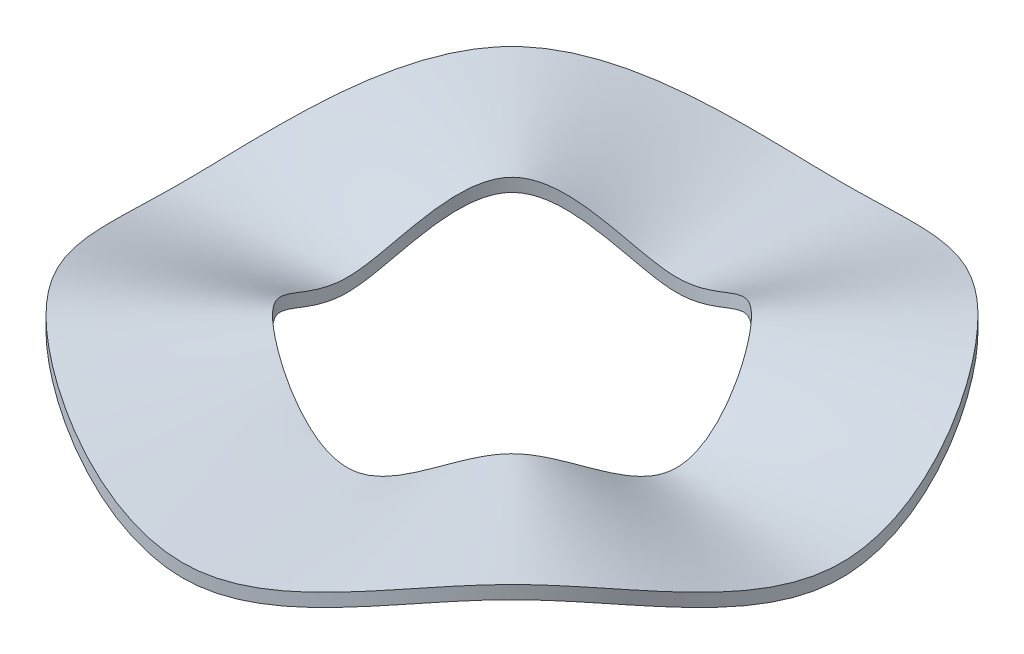
ISO-10303-21;
HEADER;
FILE_DESCRIPTION(('STEP AP214'),'2;1');
FILE_NAME('part.step','',(''),(''),'','','');
FILE_SCHEMA(('AUTOMOTIVE_DESIGN { 1 0 10303 214 1 1 1 1 }'));
ENDSEC;
DATA;
#1=APPLICATION_CONTEXT('core data for automotive mechanical design processes');
#2=APPLICATION_PROTOCOL_DEFINITION('international standard','automotive_design',2000,#1);
#3=PRODUCT_CONTEXT('',#1,'mechanical');
#4=PRODUCT('Part','Part','',(#3));
#5=PRODUCT_RELATED_PRODUCT_CATEGORY('part','',(#4));
#6=PRODUCT_DEFINITION_FORMATION('','',#4);
#7=PRODUCT_DEFINITION_CONTEXT('part definition',#1,'design');
#8=PRODUCT_DEFINITION('design','',#6,#7);
#9=PRODUCT_DEFINITION_SHAPE('','',#8);
#10=(LENGTH_UNIT() NAMED_UNIT(*) SI_UNIT(.MILLI.,.METRE.));
#11=(NAMED_UNIT(*) PLANE_ANGLE_UNIT() SI_UNIT($,.RADIAN.));
#12=(NAMED_UNIT(*) SI_UNIT($,.STERADIAN.) SOLID_ANGLE_UNIT());
#13=UNCERTAINTY_MEASURE_WITH_UNIT(LENGTH_MEASURE(1.E-05),#10,'distance_accuracy_value','');
#14=(GEOMETRIC_REPRESENTATION_CONTEXT(3) GLOBAL_UNCERTAINTY_ASSIGNED_CONTEXT((#13)) GLOBAL_UNIT_ASSIGNED_CONTEXT((#10,
#11,#12)) REPRESENTATION_CONTEXT('',''));
#15=CARTESIAN_POINT('',(0.,0.,0.));
#16=DIRECTION('',(0.,0.,1.));
#17=DIRECTION('',(1.,0.,0.));
#18=AXIS2_PLACEMENT_3D('',#15,#16,#17);
#19=CARTESIAN_POINT('',(0.,0.,-50.));
#20=CARTESIAN_POINT('',(0.681019374820098,0.,-49.9999999999936));
#21=CARTESIAN_POINT('',(2.04305812446038,0.0749999999999942,-49.9771529062029));
#22=CARTESIAN_POINT('',(4.08272213564324,0.389999999999995,-49.8743739349722));
#23=CARTESIAN_POINT('',(6.11559792027062,0.88499999999999,-49.7031195839857));
#24=CARTESIAN_POINT('',(18.2517585890349,4.79999999999999,-48.2649389042652));
#25=CARTESIAN_POINT('',(41.7750462400075,27.,-38.1370849893561));
#26=CARTESIAN_POINT('',(54.5694187554349,-15.,7.88759682568418E-10));
#27=CARTESIAN_POINT('',(40.8611624893339,30.,40.8611624895872));
#28=CARTESIAN_POINT('',(2.14408297973673E-11,-15.,54.5694187553029));
#29=CARTESIAN_POINT('',(-40.8611624890768,30.,40.8611624889877));
#30=CARTESIAN_POINT('',(-54.5694187554349,-15.,6.07656286399916E-11));
#31=CARTESIAN_POINT('',(-41.7750462402474,27.,-38.1370849899642));
#32=CARTESIAN_POINT('',(-18.2517585890206,4.80000000000001,-48.26493890461));
#33=CARTESIAN_POINT('',(-6.11559792026805,0.884999999999996,-49.7031195841012));
#34=CARTESIAN_POINT('',(-4.0827221356421,0.389999999999994,-49.8743739350492));
#35=CARTESIAN_POINT('',(-2.04305812446015,0.0749999999999938,-49.9771529062414));
#36=CARTESIAN_POINT('',(-0.681019374820087,0.,-50.0000000000064));
#37=CARTESIAN_POINT('',(0.,0.,-50.));
#38=CARTESIAN_POINT('',(0.,0.,-54.1666666666667));
#39=CARTESIAN_POINT('',(0.733102708153321,0.,-54.1666666666608));
#40=CARTESIAN_POINT('',(2.19930812446002,0.0749999999999947,-54.1412154062045));
#41=CARTESIAN_POINT('',(4.39502682314249,0.389999999999996,-54.0269129974757));
#42=CARTESIAN_POINT('',(6.58356667026945,0.88499999999999,-53.8367133339912));
#43=CARTESIAN_POINT('',(19.6501960890312,4.79999999999999,-52.2415014042833));
#44=CARTESIAN_POINT('',(45.0042129066908,27.,-41.0537516560638));
#45=CARTESIAN_POINT('',(59.2569187554349,-15.,7.22736107072741E-10));
#46=CARTESIAN_POINT('',(43.986162489316,30.,43.986162489548));
#47=CARTESIAN_POINT('',(1.96540646171112E-11,-15.,59.2569187553136));
#48=CARTESIAN_POINT('',(-43.9861624890804,30.,43.9861624889984));
#49=CARTESIAN_POINT('',(-59.2569187554349,-15.,5.54088025461752E-11));
#50=CARTESIAN_POINT('',(-45.0042129069107,27.,-41.0537516566212));
#51=CARTESIAN_POINT('',(-19.650196089018,4.80000000000001,-52.2415014045994));
#52=CARTESIAN_POINT('',(-6.58356667026708,0.884999999999996,-53.836713334097));
#53=CARTESIAN_POINT('',(-4.39502682314143,0.389999999999995,-54.0269129975463));
#54=CARTESIAN_POINT('',(-2.1993081244598,0.0749999999999943,-54.1412154062399));
#55=CARTESIAN_POINT('',(-0.733102708153293,0.,-54.1666666666725));
#56=CARTESIAN_POINT('',(0.,0.,-54.1666666666667));
#57=CARTESIAN_POINT('',(0.,0.,-62.5000000000001));
#58=CARTESIAN_POINT('',(0.837269374819747,0.,-62.4999999999953));
#59=CARTESIAN_POINT('',(2.51180812445929,0.0749999999999958,-62.4693404062079));
#60=CARTESIAN_POINT('',(5.01963619814097,0.389999999999997,-62.3319911224828));
#61=CARTESIAN_POINT('',(7.51950417026711,0.884999999999992,-62.1039008340022));
#62=CARTESIAN_POINT('',(22.4470710890237,4.79999999999999,-60.1946264043196));
#63=CARTESIAN_POINT('',(51.4625462400576,27.,-46.8870849894792));
#64=CARTESIAN_POINT('',(68.6319187554351,-15.,5.90688956081387E-10));
#65=CARTESIAN_POINT('',(50.2361624892805,30.,50.2361624894695));
#66=CARTESIAN_POINT('',(1.60909425974548E-11,-15.,68.631918755335));
#67=CARTESIAN_POINT('',(-50.2361624890876,30.,50.2361624890198));
#68=CARTESIAN_POINT('',(-68.631918755435,-15.,4.47072934228743E-11));
#69=CARTESIAN_POINT('',(-51.4625462402374,27.,-46.8870849899353));
#70=CARTESIAN_POINT('',(-22.4470710890129,4.80000000000001,-60.1946264045782));
#71=CARTESIAN_POINT('',(-7.51950417026518,0.884999999999997,-62.1039008340888));
#72=CARTESIAN_POINT('',(-5.01963619814011,0.389999999999996,-62.3319911225405));
#73=CARTESIAN_POINT('',(-2.51180812445911,0.0749999999999953,-62.4693404062368));
#74=CARTESIAN_POINT('',(-0.837269374819729,0.,-62.5000000000049));
#75=CARTESIAN_POINT('',(0.,0.,-62.5000000000001));
#76=CARTESIAN_POINT('',(0.,0.,-74.9999999999999));
#77=CARTESIAN_POINT('',(0.993519374819394,0.,-74.9999999999967));
#78=CARTESIAN_POINT('',(2.98055812445819,0.0749999999999974,-74.9615279062127));
#79=CARTESIAN_POINT('',(5.95655026063868,0.389999999999998,-74.7896083099931));
#80=CARTESIAN_POINT('',(8.92341042026357,0.884999999999993,-74.5046820840185));
#81=CARTESIAN_POINT('',(26.6423835890123,4.79999999999999,-72.1243139043738));
#82=CARTESIAN_POINT('',(61.1500462401073,27.,-55.6370849896023));
#83=CARTESIAN_POINT('',(82.6944187554347,-15.,3.92600882359595E-10));
#84=CARTESIAN_POINT('',(59.6111624892267,30.,59.6111624893517));
#85=CARTESIAN_POINT('',(1.07427901210183E-11,-15.,82.6944187553672));
#86=CARTESIAN_POINT('',(-59.6111624890982,30.,59.6111624890519));
#87=CARTESIAN_POINT('',(-82.6944187554348,-15.,2.86281415240452E-11));
#88=CARTESIAN_POINT('',(-61.1500462402273,27.,-55.6370849899063));
#89=CARTESIAN_POINT('',(-26.6423835890052,4.80000000000001,-72.1243139045462));
#90=CARTESIAN_POINT('',(-8.92341042026228,0.884999999999999,-74.5046820840762));
#91=CARTESIAN_POINT('',(-5.9565502606381,0.389999999999997,-74.7896083100316));
#92=CARTESIAN_POINT('',(-2.98055812445805,0.0749999999999968,-74.961527906232));
#93=CARTESIAN_POINT('',(-0.993519374819364,0.,-75.0000000000031));
#94=CARTESIAN_POINT('',(0.,0.,-74.9999999999999));
#95=CARTESIAN_POINT('',(0.,0.,-87.5));
#96=CARTESIAN_POINT('',(1.14976937481903,0.,-87.4999999999984));
#97=CARTESIAN_POINT('',(3.44930812445709,0.074999999999999,-87.4537154062178));
#98=CARTESIAN_POINT('',(6.89346432313641,0.39,-87.2472254975037));
#99=CARTESIAN_POINT('',(10.3273166702601,0.884999999999995,-86.905463334035));
#100=CARTESIAN_POINT('',(30.8376960890011,4.79999999999999,-84.0540014044283));
#101=CARTESIAN_POINT('',(70.8375462401575,27.,-64.3870849897255));
#102=CARTESIAN_POINT('',(96.756918755435,-15.,1.94545768383847E-10));
#103=CARTESIAN_POINT('',(68.9861624891734,30.,68.9861624892339));
#104=CARTESIAN_POINT('',(5.37382096287009E-12,-15.,96.7569187553992));
#105=CARTESIAN_POINT('',(-68.986162489109,30.,68.986162489084));
#106=CARTESIAN_POINT('',(-96.756918755435,-15.,1.25975618825436E-11));
#107=CARTESIAN_POINT('',(-70.8375462402174,27.,-64.3870849898775));
#108=CARTESIAN_POINT('',(-30.8376960889976,4.80000000000001,-84.0540014045144));
#109=CARTESIAN_POINT('',(-10.3273166702594,0.885,-86.9054633340639));
#110=CARTESIAN_POINT('',(-6.89346432313612,0.389999999999998,-87.2472254975229));
#111=CARTESIAN_POINT('',(-3.44930812445702,0.0749999999999983,-87.4537154062275));
#112=CARTESIAN_POINT('',(-1.14976937481902,0.,-87.5000000000016));
#113=CARTESIAN_POINT('',(0.,0.,-87.5));
#114=CARTESIAN_POINT('',(0.,0.,-95.8333333333333));
#115=CARTESIAN_POINT('',(1.25393604148547,0.,-95.8333333333328));
#116=CARTESIAN_POINT('',(3.76180812445636,0.075,-95.7818404062211));
#117=CARTESIAN_POINT('',(7.5180736981349,0.390000000000001,-95.5523036225106));
#118=CARTESIAN_POINT('',(11.2632541702577,0.884999999999996,-95.1726508340459));
#119=CARTESIAN_POINT('',(33.6345710889936,4.79999999999999,-92.0071264044645));
#120=CARTESIAN_POINT('',(77.295879573524,27.,-70.2204183231408));
#121=CARTESIAN_POINT('',(106.131918755435,-15.,6.24951479455405E-11));
#122=CARTESIAN_POINT('',(75.2361624891376,30.,75.2361624891554));
#123=CARTESIAN_POINT('',(1.81763783711764E-12,-15.,106.131918755421));
#124=CARTESIAN_POINT('',(-75.2361624891161,30.,75.2361624891054));
#125=CARTESIAN_POINT('',(-106.131918755435,-15.,1.88390969491081E-12));
#126=CARTESIAN_POINT('',(-77.2958795735441,27.,-70.2204183231915));
#127=CARTESIAN_POINT('',(-33.6345710889924,4.80000000000001,-92.0071264044931));
#128=CARTESIAN_POINT('',(-11.2632541702575,0.885000000000001,-95.1726508340555));
#129=CARTESIAN_POINT('',(-7.51807369813478,0.389999999999999,-95.5523036225171));
#130=CARTESIAN_POINT('',(-3.76180812445632,0.0749999999999992,-95.7818404062243));
#131=CARTESIAN_POINT('',(-1.25393604148544,0.,-95.8333333333339));
#132=CARTESIAN_POINT('',(0.,0.,-95.8333333333333));
#133=CARTESIAN_POINT('',(0.,0.,-100.));
#134=CARTESIAN_POINT('',(1.30601937481869,0.,-100.));
#135=CARTESIAN_POINT('',(3.918058124456,0.0750000000000005,-99.9459029062228));
#136=CARTESIAN_POINT('',(7.83037838563414,0.390000000000002,-99.7048426850142));
#137=CARTESIAN_POINT('',(11.7312229202565,0.884999999999997,-99.3062445840514));
#138=CARTESIAN_POINT('',(35.0330085889898,4.79999999999999,-95.9836889044826));
#139=CARTESIAN_POINT('',(80.5250462402073,27.,-73.1370849898486));
#140=CARTESIAN_POINT('',(110.819418755435,-15.,-3.53883589099269E-12));
#141=CARTESIAN_POINT('',(78.3611624891197,30.,78.3611624891161));
#142=CARTESIAN_POINT('',(0.,-15.,110.819418755431));
#143=CARTESIAN_POINT('',(-78.3611624891196,30.,78.3611624891162));
#144=CARTESIAN_POINT('',(-110.819418755435,-15.,-3.47985529280948E-12));
#145=CARTESIAN_POINT('',(-80.5250462402074,27.,-73.1370849898486));
#146=CARTESIAN_POINT('',(-35.0330085889898,4.80000000000001,-95.9836889044825));
#147=CARTESIAN_POINT('',(-11.7312229202566,0.885000000000001,-99.3062445840514));
#148=CARTESIAN_POINT('',(-7.83037838563411,0.39,-99.7048426850142));
#149=CARTESIAN_POINT('',(-3.91805812445596,0.0749999999999997,-99.9459029062228));
#150=CARTESIAN_POINT('',(-1.30601937481865,0.,-100.));
#151=CARTESIAN_POINT('',(0.,0.,-100.));
#152=B_SPLINE_SURFACE_WITH_KNOTS('',3,3,((#19,#20,#21,#22,#23,#24,#25,#26,#27,#28,#29,#30,#31,
#32,#33,#34,#35,#36,#37),(#38,#39,#40,#41,#42,#43,#44,#45,#46,#47,#48,#49,#50,#51,#52,#53,#54,
#55,#56),(#57,#58,#59,#60,#61,#62,#63,#64,#65,#66,#67,#68,#69,#70,#71,#72,#73,#74,#75),(#76,#77,
#78,#79,#80,#81,#82,#83,#84,#85,#86,#87,#88,#89,#90,#91,#92,#93,#94),(#95,#96,#97,#98,#99,#100,
#101,#102,#103,#104,#105,#106,#107,#108,#109,#110,#111,#112,#113),(#114,#115,#116,#117,#118,
#119,#120,#121,#122,#123,#124,#125,#126,#127,#128,#129,#130,#131,#132),(#133,#134,#135,#136,
#137,#138,#139,#140,#141,#142,#143,#144,#145,#146,#147,#148,#149,#150,#151)),.UNSPECIFIED.,.F.,
.T.,.F.,(4,1,1,1,4),(4,1,1,1,1,1,1,1,1,1,1,1,1,1,1,1,4),(0.537037037037037,0.652777777777778,
0.768518518518519,0.884259259259259,1.),(0.,0.00625000000000009,0.0125,0.01875,
0.0249999999999999,0.125,0.250000000003426,0.375,0.5,0.625,0.75,0.875,0.975,0.98125,0.9875,
0.99375,1.),.UNSPECIFIED.);
#153=CARTESIAN_POINT('',(0.,0.,-100.));
#154=CARTESIAN_POINT('',(1.30601937481869,0.,-100.));
#155=CARTESIAN_POINT('',(3.918058124456,0.0750000000000005,-99.9459029062228));
#156=CARTESIAN_POINT('',(7.83037838563414,0.390000000000002,-99.7048426850142));
#157=CARTESIAN_POINT('',(11.7312229202565,0.884999999999997,-99.3062445840514));
#158=CARTESIAN_POINT('',(35.0330085889898,4.79999999999999,-95.9836889044826));
#159=CARTESIAN_POINT('',(80.5250462402073,27.,-73.1370849898486));
#160=CARTESIAN_POINT('',(110.819418755435,-15.,-3.53883589099269E-12));
#161=CARTESIAN_POINT('',(78.3611624891197,30.,78.3611624891161));
#162=CARTESIAN_POINT('',(0.,-15.,110.819418755431));
#163=CARTESIAN_POINT('',(-78.3611624891196,30.,78.3611624891162));
#164=CARTESIAN_POINT('',(-110.819418755435,-15.,-3.47985529280948E-12));
#165=CARTESIAN_POINT('',(-80.5250462402074,27.,-73.1370849898486));
#166=CARTESIAN_POINT('',(-35.0330085889898,4.80000000000001,-95.9836889044825));
#167=CARTESIAN_POINT('',(-11.7312229202566,0.885000000000001,-99.3062445840514));
#168=CARTESIAN_POINT('',(-7.83037838563411,0.39,-99.7048426850142));
#169=CARTESIAN_POINT('',(-3.91805812445596,0.0749999999999997,-99.9459029062228));
#170=CARTESIAN_POINT('',(-1.30601937481865,0.,-100.));
#171=CARTESIAN_POINT('',(0.,0.,-100.));
#172=B_SPLINE_CURVE_WITH_KNOTS('',3,(#153,#154,#155,#156,#157,#158,#159,#160,#161,#162,#163,
#164,#165,#166,#167,#168,#169,#170,#171),.UNSPECIFIED.,.T.,.F.,(4,1,1,1,1,1,1,1,1,1,1,1,1,1,1,1,
4),(0.,0.00625000000000009,0.0125,0.01875,0.0249999999999999,0.125,0.250000000003426,0.375,0.5,
0.625,0.75,0.875,0.975,0.98125,0.9875,0.99375,1.),.UNSPECIFIED.);
#173=CARTESIAN_POINT('',(0.,0.,-100.));
#174=VERTEX_POINT('',#173);
#175=EDGE_CURVE('E11',#174,#174,#172,.T.);
#176=CARTESIAN_POINT('',(0.,0.,-50.));
#177=CARTESIAN_POINT('',(0.681019374820098,0.,-49.9999999999936));
#178=CARTESIAN_POINT('',(2.04305812446038,0.0749999999999942,-49.9771529062029));
#179=CARTESIAN_POINT('',(4.08272213564324,0.389999999999995,-49.8743739349722));
#180=CARTESIAN_POINT('',(6.11559792027062,0.88499999999999,-49.7031195839857));
#181=CARTESIAN_POINT('',(18.2517585890349,4.79999999999999,-48.2649389042652));
#182=CARTESIAN_POINT('',(41.7750462400075,27.,-38.1370849893561));
#183=CARTESIAN_POINT('',(54.5694187554349,-15.,7.88759682568418E-10));
#184=CARTESIAN_POINT('',(40.8611624893339,30.,40.8611624895872));
#185=CARTESIAN_POINT('',(2.14408297973673E-11,-15.,54.5694187553029));
#186=CARTESIAN_POINT('',(-40.8611624890768,30.,40.8611624889877));
#187=CARTESIAN_POINT('',(-54.5694187554349,-15.,6.07656286399916E-11));
#188=CARTESIAN_POINT('',(-41.7750462402474,27.,-38.1370849899642));
#189=CARTESIAN_POINT('',(-18.2517585890206,4.80000000000001,-48.26493890461));
#190=CARTESIAN_POINT('',(-6.11559792026805,0.884999999999996,-49.7031195841012));
#191=CARTESIAN_POINT('',(-4.0827221356421,0.389999999999994,-49.8743739350492));
#192=CARTESIAN_POINT('',(-2.04305812446015,0.0749999999999938,-49.9771529062414));
#193=CARTESIAN_POINT('',(-0.681019374820087,0.,-50.0000000000064));
#194=CARTESIAN_POINT('',(0.,0.,-50.));
#195=B_SPLINE_CURVE_WITH_KNOTS('',3,(#176,#177,#178,#179,#180,#181,#182,#183,#184,#185,#186,
#187,#188,#189,#190,#191,#192,#193,#194),.UNSPECIFIED.,.T.,.F.,(4,1,1,1,1,1,1,1,1,1,1,1,1,1,1,1,
4),(0.,0.00625000000000009,0.0125,0.01875,0.0249999999999999,0.125,0.250000000003426,0.375,0.5,
0.625,0.75,0.875,0.975,0.98125,0.9875,0.99375,1.),.UNSPECIFIED.);
#196=CARTESIAN_POINT('',(0.,0.,-50.));
#197=VERTEX_POINT('',#196);
#198=EDGE_CURVE('E50',#197,#197,#195,.T.);
#199=ORIENTED_EDGE('',*,*,#175,.T.);
#200=EDGE_LOOP('',(#199));
#201=FACE_BOUND('',#200,.T.);
#202=ORIENTED_EDGE('',*,*,#198,.F.);
#203=EDGE_LOOP('',(#202));
#204=FACE_BOUND('',#203,.T.);
#205=ADVANCED_FACE('F45',(#201,#204),#152,.T.);
#206=CARTESIAN_POINT('',(0.,3.99999999999999,-50.));
#207=CARTESIAN_POINT('',(0.681019374820098,3.99999999999999,-49.9999999999936));
#208=CARTESIAN_POINT('',(2.04305812446038,4.07499999999999,-49.9771529062029));
#209=CARTESIAN_POINT('',(4.08272213564324,4.39,-49.8743739349722));
#210=CARTESIAN_POINT('',(6.11559792027062,4.88499999999999,-49.7031195839857));
#211=CARTESIAN_POINT('',(18.2517585890349,8.79999999999999,-48.2649389042652));
#212=CARTESIAN_POINT('',(41.7750462400075,31.,-38.1370849893561));
#213=CARTESIAN_POINT('',(54.5694187554349,-11.,7.88759682568418E-10));
#214=CARTESIAN_POINT('',(40.8611624893339,34.,40.8611624895872));
#215=CARTESIAN_POINT('',(2.14408297973673E-11,-11.,54.5694187553029));
#216=CARTESIAN_POINT('',(-40.8611624890768,34.,40.8611624889877));
#217=CARTESIAN_POINT('',(-54.5694187554349,-11.,6.07656286399916E-11));
#218=CARTESIAN_POINT('',(-41.7750462402474,31.,-38.1370849899642));
#219=CARTESIAN_POINT('',(-18.2517585890206,8.8,-48.26493890461));
#220=CARTESIAN_POINT('',(-6.11559792026805,4.885,-49.7031195841012));
#221=CARTESIAN_POINT('',(-4.0827221356421,4.38999999999999,-49.8743739350492));
#222=CARTESIAN_POINT('',(-2.04305812446015,4.07499999999999,-49.9771529062414));
#223=CARTESIAN_POINT('',(-0.681019374820087,3.99999999999999,-50.0000000000064));
#224=CARTESIAN_POINT('',(0.,3.99999999999999,-50.));
#225=CARTESIAN_POINT('',(0.,3.66666666666666,-50.));
#226=CARTESIAN_POINT('',(0.681019374820101,3.66666666666666,-49.9999999999936));
#227=CARTESIAN_POINT('',(2.04305812446038,3.74166666666666,-49.9771529062029));
#228=CARTESIAN_POINT('',(4.08272213564324,4.05666666666666,-49.8743739349722));
#229=CARTESIAN_POINT('',(6.11559792027062,4.55166666666666,-49.7031195839857));
#230=CARTESIAN_POINT('',(18.2517585890349,8.46666666666665,-48.2649389042652));
#231=CARTESIAN_POINT('',(41.7750462400075,30.6666666666667,-38.1370849893561));
#232=CARTESIAN_POINT('',(54.5694187554349,-11.3333333333333,7.88759682568418E-10));
#233=CARTESIAN_POINT('',(40.8611624893339,33.6666666666667,40.8611624895872));
#234=CARTESIAN_POINT('',(2.14460339677952E-11,-11.3333333333333,54.5694187553029));
#235=CARTESIAN_POINT('',(-40.8611624890768,33.6666666666667,40.8611624889877));
#236=CARTESIAN_POINT('',(-54.5694187554349,-11.3333333333333,6.07656286399916E-11));
#237=CARTESIAN_POINT('',(-41.7750462402474,30.6666666666667,-38.1370849899642));
#238=CARTESIAN_POINT('',(-18.2517585890206,8.46666666666667,-48.26493890461));
#239=CARTESIAN_POINT('',(-6.11559792026804,4.55166666666666,-49.7031195841012));
#240=CARTESIAN_POINT('',(-4.0827221356421,4.05666666666666,-49.8743739350492));
#241=CARTESIAN_POINT('',(-2.04305812446015,3.74166666666666,-49.9771529062414));
#242=CARTESIAN_POINT('',(-0.681019374820084,3.66666666666666,-50.0000000000064));
#243=CARTESIAN_POINT('',(0.,3.66666666666666,-50.));
#244=CARTESIAN_POINT('',(0.,2.99999999999999,-49.9999999999999));
#245=CARTESIAN_POINT('',(0.681019374820101,2.99999999999999,-49.9999999999935));
#246=CARTESIAN_POINT('',(2.04305812446038,3.07499999999999,-49.9771529062028));
#247=CARTESIAN_POINT('',(4.08272213564324,3.38999999999999,-49.8743739349722));
#248=CARTESIAN_POINT('',(6.11559792027062,3.88499999999999,-49.7031195839857));
#249=CARTESIAN_POINT('',(18.2517585890349,7.79999999999998,-48.2649389042651));
#250=CARTESIAN_POINT('',(41.7750462400075,30.,-38.137084989356));
#251=CARTESIAN_POINT('',(54.5694187554349,-12.,7.88752743674515E-10));
#252=CARTESIAN_POINT('',(40.8611624893339,33.,40.8611624895872));
#253=CARTESIAN_POINT('',(2.14390950738913E-11,-12.,54.5694187553029));
#254=CARTESIAN_POINT('',(-40.8611624890768,33.,40.8611624889877));
#255=CARTESIAN_POINT('',(-54.5694187554349,-12.,6.07552202991357E-11));
#256=CARTESIAN_POINT('',(-41.7750462402473,30.,-38.1370849899642));
#257=CARTESIAN_POINT('',(-18.2517585890206,7.8,-48.26493890461));
#258=CARTESIAN_POINT('',(-6.11559792026804,3.88499999999999,-49.7031195841011));
#259=CARTESIAN_POINT('',(-4.0827221356421,3.38999999999999,-49.8743739350492));
#260=CARTESIAN_POINT('',(-2.04305812446015,3.07499999999999,-49.9771529062414));
#261=CARTESIAN_POINT('',(-0.681019374820084,2.99999999999999,-50.0000000000064));
#262=CARTESIAN_POINT('',(0.,2.99999999999999,-49.9999999999999));
#263=CARTESIAN_POINT('',(0.,1.99999999999999,-50.));
#264=CARTESIAN_POINT('',(0.681019374820102,1.99999999999999,-49.9999999999936));
#265=CARTESIAN_POINT('',(2.04305812446038,2.07499999999999,-49.9771529062029));
#266=CARTESIAN_POINT('',(4.08272213564325,2.38999999999999,-49.8743739349722));
#267=CARTESIAN_POINT('',(6.11559792027063,2.88499999999998,-49.7031195839858));
#268=CARTESIAN_POINT('',(18.2517585890349,6.79999999999998,-48.2649389042652));
#269=CARTESIAN_POINT('',(41.7750462400075,29.,-38.1370849893561));
#270=CARTESIAN_POINT('',(54.5694187554349,-13.,7.88766621462322E-10));
#271=CARTESIAN_POINT('',(40.8611624893339,32.,40.8611624895872));
#272=CARTESIAN_POINT('',(2.14442992443192E-11,-13.,54.5694187553028));
#273=CARTESIAN_POINT('',(-40.8611624890768,32.,40.8611624889877));
#274=CARTESIAN_POINT('',(-54.5694187554349,-13.,6.07743022573715E-11));
#275=CARTESIAN_POINT('',(-41.7750462402474,29.,-38.1370849899642));
#276=CARTESIAN_POINT('',(-18.2517585890206,6.8,-48.26493890461));
#277=CARTESIAN_POINT('',(-6.11559792026805,2.88499999999999,-49.7031195841012));
#278=CARTESIAN_POINT('',(-4.0827221356421,2.38999999999999,-49.8743739350493));
#279=CARTESIAN_POINT('',(-2.04305812446015,2.07499999999999,-49.9771529062415));
#280=CARTESIAN_POINT('',(-0.681019374820084,1.99999999999999,-50.0000000000064));
#281=CARTESIAN_POINT('',(0.,1.99999999999999,-50.));
#282=CARTESIAN_POINT('',(0.,0.99999999999999,-50.));
#283=CARTESIAN_POINT('',(0.681019374820102,0.99999999999999,-49.9999999999935));
#284=CARTESIAN_POINT('',(2.04305812446038,1.07499999999999,-49.9771529062029));
#285=CARTESIAN_POINT('',(4.08272213564324,1.38999999999999,-49.8743739349722));
#286=CARTESIAN_POINT('',(6.11559792027062,1.88499999999999,-49.7031195839857));
#287=CARTESIAN_POINT('',(18.2517585890349,5.79999999999998,-48.2649389042652));
#288=CARTESIAN_POINT('',(41.7750462400075,28.,-38.137084989356));
#289=CARTESIAN_POINT('',(54.5694187554349,-14.,7.88749274227563E-10));
#290=CARTESIAN_POINT('',(40.8611624893339,31.,40.8611624895872));
#291=CARTESIAN_POINT('',(2.14408297973673E-11,-14.,54.5694187553029));
#292=CARTESIAN_POINT('',(-40.8611624890768,31.,40.8611624889877));
#293=CARTESIAN_POINT('',(-54.5694187554349,-14.,6.07586897460877E-11));
#294=CARTESIAN_POINT('',(-41.7750462402473,28.,-38.1370849899642));
#295=CARTESIAN_POINT('',(-18.2517585890206,5.8,-48.26493890461));
#296=CARTESIAN_POINT('',(-6.11559792026804,1.88499999999999,-49.7031195841011));
#297=CARTESIAN_POINT('',(-4.0827221356421,1.38999999999999,-49.8743739350492));
#298=CARTESIAN_POINT('',(-2.04305812446015,1.07499999999999,-49.9771529062414));
#299=CARTESIAN_POINT('',(-0.681019374820083,0.99999999999999,-50.0000000000064));
#300=CARTESIAN_POINT('',(0.,0.99999999999999,-50.));
#301=CARTESIAN_POINT('',(0.,0.333333333333324,-50.));
#302=CARTESIAN_POINT('',(0.681019374820098,0.333333333333324,-49.9999999999936));
#303=CARTESIAN_POINT('',(2.04305812446038,0.408333333333325,-49.9771529062029));
#304=CARTESIAN_POINT('',(4.08272213564324,0.723333333333325,-49.8743739349722));
#305=CARTESIAN_POINT('',(6.11559792027062,1.21833333333332,-49.7031195839857));
#306=CARTESIAN_POINT('',(18.2517585890349,5.13333333333332,-48.2649389042652));
#307=CARTESIAN_POINT('',(41.7750462400075,27.3333333333333,-38.1370849893561));
#308=CARTESIAN_POINT('',(54.5694187554349,-14.6666666666667,7.88757947844942E-10));
#309=CARTESIAN_POINT('',(40.8611624893339,30.3333333333333,40.8611624895872));
#310=CARTESIAN_POINT('',(2.14408297973673E-11,-14.6666666666667,54.5694187553029));
#311=CARTESIAN_POINT('',(-40.8611624890768,30.3333333333333,40.8611624889877));
#312=CARTESIAN_POINT('',(-54.5694187554349,-14.6666666666667,6.07638939165156E-11));
#313=CARTESIAN_POINT('',(-41.7750462402474,27.3333333333333,-38.1370849899642));
#314=CARTESIAN_POINT('',(-18.2517585890206,5.13333333333334,-48.26493890461));
#315=CARTESIAN_POINT('',(-6.11559792026805,1.21833333333333,-49.7031195841012));
#316=CARTESIAN_POINT('',(-4.0827221356421,0.723333333333325,-49.8743739350492));
#317=CARTESIAN_POINT('',(-2.04305812446015,0.408333333333324,-49.9771529062414));
#318=CARTESIAN_POINT('',(-0.681019374820087,0.333333333333324,-50.0000000000064));
#319=CARTESIAN_POINT('',(0.,0.333333333333324,-50.));
#320=CARTESIAN_POINT('',(0.,0.,-50.));
#321=CARTESIAN_POINT('',(0.681019374820098,0.,-49.9999999999936));
#322=CARTESIAN_POINT('',(2.04305812446038,0.0749999999999942,-49.9771529062029));
#323=CARTESIAN_POINT('',(4.08272213564324,0.389999999999995,-49.8743739349722));
#324=CARTESIAN_POINT('',(6.11559792027062,0.88499999999999,-49.7031195839857));
#325=CARTESIAN_POINT('',(18.2517585890349,4.79999999999999,-48.2649389042652));
#326=CARTESIAN_POINT('',(41.7750462400075,27.,-38.1370849893561));
#327=CARTESIAN_POINT('',(54.5694187554349,-15.,7.88759682568418E-10));
#328=CARTESIAN_POINT('',(40.8611624893339,30.,40.8611624895872));
#329=CARTESIAN_POINT('',(2.14408297973673E-11,-15.,54.5694187553029));
#330=CARTESIAN_POINT('',(-40.8611624890768,30.,40.8611624889877));
#331=CARTESIAN_POINT('',(-54.5694187554349,-15.,6.07656286399916E-11));
#332=CARTESIAN_POINT('',(-41.7750462402474,27.,-38.1370849899642));
#333=CARTESIAN_POINT('',(-18.2517585890206,4.80000000000001,-48.26493890461));
#334=CARTESIAN_POINT('',(-6.11559792026805,0.884999999999996,-49.7031195841012));
#335=CARTESIAN_POINT('',(-4.0827221356421,0.389999999999994,-49.8743739350492));
#336=CARTESIAN_POINT('',(-2.04305812446015,0.0749999999999938,-49.9771529062414));
#337=CARTESIAN_POINT('',(-0.681019374820087,0.,-50.0000000000064));
#338=CARTESIAN_POINT('',(0.,0.,-50.));
#339=B_SPLINE_SURFACE_WITH_KNOTS('',3,3,((#206,#207,#208,#209,#210,#211,#212,#213,#214,#215,
#216,#217,#218,#219,#220,#221,#222,#223,#224),(#225,#226,#227,#228,#229,#230,#231,#232,#233,
#234,#235,#236,#237,#238,#239,#240,#241,#242,#243),(#244,#245,#246,#247,#248,#249,#250,#251,
#252,#253,#254,#255,#256,#257,#258,#259,#260,#261,#262),(#263,#264,#265,#266,#267,#268,#269,
#270,#271,#272,#273,#274,#275,#276,#277,#278,#279,#280,#281),(#282,#283,#284,#285,#286,#287,
#288,#289,#290,#291,#292,#293,#294,#295,#296,#297,#298,#299,#300),(#301,#302,#303,#304,#305,
#306,#307,#308,#309,#310,#311,#312,#313,#314,#315,#316,#317,#318,#319),(#320,#321,#322,#323,
#324,#325,#326,#327,#328,#329,#330,#331,#332,#333,#334,#335,#336,#337,#338)),.UNSPECIFIED.,.F.,
.T.,.F.,(4,1,1,1,4),(4,1,1,1,1,1,1,1,1,1,1,1,1,1,1,1,4),(0.5,0.509259259259259,
0.518518518518519,0.527777777777778,0.537037037037037),(0.,0.00625000000000009,0.0125,0.01875,
0.0249999999999999,0.125,0.250000000003426,0.375,0.5,0.625,0.75,0.875,0.975,0.98125,0.9875,
0.99375,1.),.UNSPECIFIED.);
#340=CARTESIAN_POINT('',(0.,3.99999999999999,-50.));
#341=CARTESIAN_POINT('',(0.681019374820098,3.99999999999999,-49.9999999999936));
#342=CARTESIAN_POINT('',(2.04305812446038,4.07499999999999,-49.9771529062029));
#343=CARTESIAN_POINT('',(4.08272213564324,4.39,-49.8743739349722));
#344=CARTESIAN_POINT('',(6.11559792027062,4.88499999999999,-49.7031195839857));
#345=CARTESIAN_POINT('',(18.2517585890349,8.79999999999999,-48.2649389042652));
#346=CARTESIAN_POINT('',(41.7750462400075,31.,-38.1370849893561));
#347=CARTESIAN_POINT('',(54.5694187554349,-11.,7.88759682568418E-10));
#348=CARTESIAN_POINT('',(40.8611624893339,34.,40.8611624895872));
#349=CARTESIAN_POINT('',(2.14408297973673E-11,-11.,54.5694187553029));
#350=CARTESIAN_POINT('',(-40.8611624890768,34.,40.8611624889877));
#351=CARTESIAN_POINT('',(-54.5694187554349,-11.,6.07656286399916E-11));
#352=CARTESIAN_POINT('',(-41.7750462402474,31.,-38.1370849899642));
#353=CARTESIAN_POINT('',(-18.2517585890206,8.8,-48.26493890461));
#354=CARTESIAN_POINT('',(-6.11559792026805,4.885,-49.7031195841012));
#355=CARTESIAN_POINT('',(-4.0827221356421,4.38999999999999,-49.8743739350492));
#356=CARTESIAN_POINT('',(-2.04305812446015,4.07499999999999,-49.9771529062414));
#357=CARTESIAN_POINT('',(-0.681019374820087,3.99999999999999,-50.0000000000064));
#358=CARTESIAN_POINT('',(0.,3.99999999999999,-50.));
#359=B_SPLINE_CURVE_WITH_KNOTS('',3,(#340,#341,#342,#343,#344,#345,#346,#347,#348,#349,#350,
#351,#352,#353,#354,#355,#356,#357,#358),.UNSPECIFIED.,.T.,.F.,(4,1,1,1,1,1,1,1,1,1,1,1,1,1,1,1,
4),(0.,0.00625000000000009,0.0125,0.01875,0.0249999999999999,0.125,0.250000000003426,0.375,0.5,
0.625,0.75,0.875,0.975,0.98125,0.9875,0.99375,1.),.UNSPECIFIED.);
#360=CARTESIAN_POINT('',(0.,3.99999999999999,-50.));
#361=VERTEX_POINT('',#360);
#362=EDGE_CURVE('E62',#361,#361,#359,.T.);
#363=ORIENTED_EDGE('',*,*,#198,.T.);
#364=EDGE_LOOP('',(#363));
#365=FACE_BOUND('',#364,.T.);
#366=ORIENTED_EDGE('',*,*,#362,.F.);
#367=EDGE_LOOP('',(#366));
#368=FACE_BOUND('',#367,.T.);
#369=ADVANCED_FACE('F89',(#365,#368),#339,.T.);
#370=CARTESIAN_POINT('',(0.,4.,-100.));
#371=CARTESIAN_POINT('',(1.30601937481869,4.,-100.));
#372=CARTESIAN_POINT('',(3.918058124456,4.075,-99.9459029062228));
#373=CARTESIAN_POINT('',(7.83037838563414,4.39,-99.7048426850142));
#374=CARTESIAN_POINT('',(11.7312229202565,4.885,-99.3062445840514));
#375=CARTESIAN_POINT('',(35.0330085889898,8.8,-95.9836889044826));
#376=CARTESIAN_POINT('',(80.5250462402073,31.,-73.1370849898486));
#377=CARTESIAN_POINT('',(110.819418755435,-11.,-3.53883589099269E-12));
#378=CARTESIAN_POINT('',(78.3611624891197,34.,78.3611624891161));
#379=CARTESIAN_POINT('',(0.,-11.,110.819418755431));
#380=CARTESIAN_POINT('',(-78.3611624891196,34.,78.3611624891162));
#381=CARTESIAN_POINT('',(-110.819418755435,-11.,-3.47985529280948E-12));
#382=CARTESIAN_POINT('',(-80.5250462402074,31.,-73.1370849898486));
#383=CARTESIAN_POINT('',(-35.0330085889898,8.80000000000001,-95.9836889044825));
#384=CARTESIAN_POINT('',(-11.7312229202566,4.885,-99.3062445840514));
#385=CARTESIAN_POINT('',(-7.83037838563411,4.39,-99.7048426850142));
#386=CARTESIAN_POINT('',(-3.91805812445596,4.075,-99.9459029062228));
#387=CARTESIAN_POINT('',(-1.30601937481865,4.,-100.));
#388=CARTESIAN_POINT('',(0.,4.,-100.));
#389=CARTESIAN_POINT('',(0.,4.,-95.8333333333333));
#390=CARTESIAN_POINT('',(1.25393604148547,4.,-95.8333333333328));
#391=CARTESIAN_POINT('',(3.76180812445636,4.075,-95.7818404062211));
#392=CARTESIAN_POINT('',(7.5180736981349,4.39,-95.5523036225106));
#393=CARTESIAN_POINT('',(11.2632541702577,4.885,-95.1726508340459));
#394=CARTESIAN_POINT('',(33.6345710889936,8.79999999999999,-92.0071264044645));
#395=CARTESIAN_POINT('',(77.295879573524,31.,-70.2204183231408));
#396=CARTESIAN_POINT('',(106.131918755435,-11.,6.24951479455405E-11));
#397=CARTESIAN_POINT('',(75.2361624891376,34.,75.2361624891554));
#398=CARTESIAN_POINT('',(1.81763783711764E-12,-11.,106.131918755421));
#399=CARTESIAN_POINT('',(-75.2361624891161,34.,75.2361624891054));
#400=CARTESIAN_POINT('',(-106.131918755435,-11.,1.88390969491081E-12));
#401=CARTESIAN_POINT('',(-77.2958795735441,31.,-70.2204183231915));
#402=CARTESIAN_POINT('',(-33.6345710889924,8.80000000000001,-92.0071264044931));
#403=CARTESIAN_POINT('',(-11.2632541702575,4.885,-95.1726508340555));
#404=CARTESIAN_POINT('',(-7.51807369813478,4.39,-95.5523036225171));
#405=CARTESIAN_POINT('',(-3.76180812445632,4.075,-95.7818404062243));
#406=CARTESIAN_POINT('',(-1.25393604148544,4.,-95.8333333333339));
#407=CARTESIAN_POINT('',(0.,4.,-95.8333333333333));
#408=CARTESIAN_POINT('',(0.,4.,-87.5));
#409=CARTESIAN_POINT('',(1.14976937481903,4.,-87.4999999999984));
#410=CARTESIAN_POINT('',(3.44930812445708,4.075,-87.4537154062178));
#411=CARTESIAN_POINT('',(6.8934643231364,4.39,-87.2472254975037));
#412=CARTESIAN_POINT('',(10.32731667026,4.885,-86.905463334035));
#413=CARTESIAN_POINT('',(30.8376960890011,8.8,-84.0540014044283));
#414=CARTESIAN_POINT('',(70.8375462401573,31.,-64.3870849897255));
#415=CARTESIAN_POINT('',(96.7569187554348,-11.,1.94535360042991E-10));
#416=CARTESIAN_POINT('',(68.9861624891732,34.,68.9861624892339));
#417=CARTESIAN_POINT('',(5.39810709153377E-12,-11.,96.7569187553992));
#418=CARTESIAN_POINT('',(-68.9861624891089,34.,68.986162489084));
#419=CARTESIAN_POINT('',(-96.7569187554349,-11.,1.25802146477838E-11));
#420=CARTESIAN_POINT('',(-70.8375462402174,31.,-64.3870849898775));
#421=CARTESIAN_POINT('',(-30.8376960889975,8.80000000000001,-84.0540014045144));
#422=CARTESIAN_POINT('',(-10.3273166702594,4.885,-86.9054633340638));
#423=CARTESIAN_POINT('',(-6.89346432313611,4.39,-87.2472254975229));
#424=CARTESIAN_POINT('',(-3.44930812445702,4.075,-87.4537154062274));
#425=CARTESIAN_POINT('',(-1.14976937481902,4.,-87.5000000000016));
#426=CARTESIAN_POINT('',(0.,4.,-87.5));
#427=CARTESIAN_POINT('',(0.,3.99999999999999,-75.0000000000001));
#428=CARTESIAN_POINT('',(0.993519374819398,3.99999999999999,-74.9999999999969));
#429=CARTESIAN_POINT('',(2.9805581244582,4.075,-74.9615279062129));
#430=CARTESIAN_POINT('',(5.9565502606387,4.39,-74.7896083099933));
#431=CARTESIAN_POINT('',(8.9234104202636,4.88499999999999,-74.5046820840187));
#432=CARTESIAN_POINT('',(26.6423835890124,8.79999999999999,-72.124313904374));
#433=CARTESIAN_POINT('',(61.1500462401076,31.,-55.6370849896024));
#434=CARTESIAN_POINT('',(82.6944187554351,-11.,3.92614760147403E-10));
#435=CARTESIAN_POINT('',(59.6111624892269,34.,59.6111624893517));
#436=CARTESIAN_POINT('',(1.07202387158306E-11,-11.,82.6944187553672));
#437=CARTESIAN_POINT('',(-59.6111624890983,34.,59.611162489052));
#438=CARTESIAN_POINT('',(-82.694418755435,-11.,2.86402845883771E-11));
#439=CARTESIAN_POINT('',(-61.1500462402275,31.,-55.6370849899065));
#440=CARTESIAN_POINT('',(-26.6423835890053,8.80000000000001,-72.1243139045464));
#441=CARTESIAN_POINT('',(-8.92341042026231,4.885,-74.5046820840764));
#442=CARTESIAN_POINT('',(-5.95655026063811,4.38999999999999,-74.7896083100318));
#443=CARTESIAN_POINT('',(-2.98055812445806,4.07499999999999,-74.9615279062322));
#444=CARTESIAN_POINT('',(-0.993519374819367,3.99999999999999,-75.0000000000033));
#445=CARTESIAN_POINT('',(0.,3.99999999999999,-75.0000000000001));
#446=CARTESIAN_POINT('',(0.,4.,-62.4999999999999));
#447=CARTESIAN_POINT('',(0.837269374819744,4.,-62.4999999999951));
#448=CARTESIAN_POINT('',(2.51180812445928,4.075,-62.4693404062078));
#449=CARTESIAN_POINT('',(5.01963619814096,4.39,-62.3319911224826));
#450=CARTESIAN_POINT('',(7.51950417026709,4.88499999999999,-62.1039008340021));
#451=CARTESIAN_POINT('',(22.4470710890236,8.79999999999999,-60.1946264043195));
#452=CARTESIAN_POINT('',(51.4625462400574,31.,-46.8870849894791));
#453=CARTESIAN_POINT('',(68.6319187554348,-11.,5.90682017187483E-10));
#454=CARTESIAN_POINT('',(50.2361624892803,34.,50.2361624894694));
#455=CARTESIAN_POINT('',(1.60874731505029E-11,-11.,68.6319187553349));
#456=CARTESIAN_POINT('',(-50.2361624890875,34.,50.2361624890197));
#457=CARTESIAN_POINT('',(-68.6319187554348,-11.,4.46986198054944E-11));
#458=CARTESIAN_POINT('',(-51.4625462402373,31.,-46.8870849899352));
#459=CARTESIAN_POINT('',(-22.4470710890129,8.80000000000001,-60.1946264045781));
#460=CARTESIAN_POINT('',(-7.51950417026517,4.885,-62.1039008340886));
#461=CARTESIAN_POINT('',(-5.0196361981401,4.39,-62.3319911225404));
#462=CARTESIAN_POINT('',(-2.51180812445911,4.075,-62.4693404062367));
#463=CARTESIAN_POINT('',(-0.837269374819728,4.,-62.5000000000047));
#464=CARTESIAN_POINT('',(0.,4.,-62.4999999999999));
#465=CARTESIAN_POINT('',(0.,3.99999999999999,-54.1666666666667));
#466=CARTESIAN_POINT('',(0.73310270815332,3.99999999999999,-54.1666666666608));
#467=CARTESIAN_POINT('',(2.19930812446002,4.07499999999999,-54.1412154062045));
#468=CARTESIAN_POINT('',(4.39502682314249,4.39,-54.0269129974757));
#469=CARTESIAN_POINT('',(6.58356667026945,4.88499999999999,-53.8367133339912));
#470=CARTESIAN_POINT('',(19.6501960890312,8.79999999999999,-52.2415014042833));
#471=CARTESIAN_POINT('',(45.0042129066908,31.,-41.0537516560638));
#472=CARTESIAN_POINT('',(59.2569187554349,-11.,7.22734372349265E-10));
#473=CARTESIAN_POINT('',(43.986162489316,34.,43.986162489548));
#474=CARTESIAN_POINT('',(1.96540646171112E-11,-11.,59.2569187553136));
#475=CARTESIAN_POINT('',(-43.9861624890804,34.,43.9861624889984));
#476=CARTESIAN_POINT('',(-59.2569187554349,-11.,5.54070678226992E-11));
#477=CARTESIAN_POINT('',(-45.0042129069107,31.,-41.0537516566212));
#478=CARTESIAN_POINT('',(-19.650196089018,8.80000000000001,-52.2415014045994));
#479=CARTESIAN_POINT('',(-6.58356667026708,4.885,-53.836713334097));
#480=CARTESIAN_POINT('',(-4.39502682314143,4.38999999999999,-54.0269129975463));
#481=CARTESIAN_POINT('',(-2.1993081244598,4.07499999999999,-54.1412154062399));
#482=CARTESIAN_POINT('',(-0.733102708153295,3.99999999999999,-54.1666666666725));
#483=CARTESIAN_POINT('',(0.,3.99999999999999,-54.1666666666667));
#484=CARTESIAN_POINT('',(0.,3.99999999999999,-50.));
#485=CARTESIAN_POINT('',(0.681019374820098,3.99999999999999,-49.9999999999936));
#486=CARTESIAN_POINT('',(2.04305812446038,4.07499999999999,-49.9771529062029));
#487=CARTESIAN_POINT('',(4.08272213564324,4.39,-49.8743739349722));
#488=CARTESIAN_POINT('',(6.11559792027062,4.88499999999999,-49.7031195839857));
#489=CARTESIAN_POINT('',(18.2517585890349,8.79999999999999,-48.2649389042652));
#490=CARTESIAN_POINT('',(41.7750462400075,31.,-38.1370849893561));
#491=CARTESIAN_POINT('',(54.5694187554349,-11.,7.88759682568418E-10));
#492=CARTESIAN_POINT('',(40.8611624893339,34.,40.8611624895872));
#493=CARTESIAN_POINT('',(2.14408297973673E-11,-11.,54.5694187553029));
#494=CARTESIAN_POINT('',(-40.8611624890768,34.,40.8611624889877));
#495=CARTESIAN_POINT('',(-54.5694187554349,-11.,6.07656286399916E-11));
#496=CARTESIAN_POINT('',(-41.7750462402474,31.,-38.1370849899642));
#497=CARTESIAN_POINT('',(-18.2517585890206,8.8,-48.26493890461));
#498=CARTESIAN_POINT('',(-6.11559792026805,4.885,-49.7031195841012));
#499=CARTESIAN_POINT('',(-4.0827221356421,4.38999999999999,-49.8743739350492));
#500=CARTESIAN_POINT('',(-2.04305812446015,4.07499999999999,-49.9771529062414));
#501=CARTESIAN_POINT('',(-0.681019374820087,3.99999999999999,-50.0000000000064));
#502=CARTESIAN_POINT('',(0.,3.99999999999999,-50.));
#503=B_SPLINE_SURFACE_WITH_KNOTS('',3,3,((#370,#371,#372,#373,#374,#375,#376,#377,#378,#379,
#380,#381,#382,#383,#384,#385,#386,#387,#388),(#389,#390,#391,#392,#393,#394,#395,#396,#397,
#398,#399,#400,#401,#402,#403,#404,#405,#406,#407),(#408,#409,#410,#411,#412,#413,#414,#415,
#416,#417,#418,#419,#420,#421,#422,#423,#424,#425,#426),(#427,#428,#429,#430,#431,#432,#433,
#434,#435,#436,#437,#438,#439,#440,#441,#442,#443,#444,#445),(#446,#447,#448,#449,#450,#451,
#452,#453,#454,#455,#456,#457,#458,#459,#460,#461,#462,#463,#464),(#465,#466,#467,#468,#469,
#470,#471,#472,#473,#474,#475,#476,#477,#478,#479,#480,#481,#482,#483),(#484,#485,#486,#487,
#488,#489,#490,#491,#492,#493,#494,#495,#496,#497,#498,#499,#500,#501,#502)),.UNSPECIFIED.,.F.,
.T.,.F.,(4,1,1,1,4),(4,1,1,1,1,1,1,1,1,1,1,1,1,1,1,1,4),(0.037037037037037,0.152777777777778,
0.268518518518518,0.384259259259259,0.5),(0.,0.00625000000000009,0.0125,0.01875,
0.0249999999999999,0.125,0.250000000003426,0.375,0.5,0.625,0.75,0.875,0.975,0.98125,0.9875,
0.99375,1.),.UNSPECIFIED.);
#504=CARTESIAN_POINT('',(0.,4.,-100.));
#505=CARTESIAN_POINT('',(1.30601937481869,4.,-100.));
#506=CARTESIAN_POINT('',(3.918058124456,4.075,-99.9459029062228));
#507=CARTESIAN_POINT('',(7.83037838563414,4.39,-99.7048426850142));
#508=CARTESIAN_POINT('',(11.7312229202565,4.885,-99.3062445840514));
#509=CARTESIAN_POINT('',(35.0330085889898,8.8,-95.9836889044826));
#510=CARTESIAN_POINT('',(80.5250462402073,31.,-73.1370849898486));
#511=CARTESIAN_POINT('',(110.819418755435,-11.,-3.53883589099269E-12));
#512=CARTESIAN_POINT('',(78.3611624891197,34.,78.3611624891161));
#513=CARTESIAN_POINT('',(0.,-11.,110.819418755431));
#514=CARTESIAN_POINT('',(-78.3611624891196,34.,78.3611624891162));
#515=CARTESIAN_POINT('',(-110.819418755435,-11.,-3.47985529280948E-12));
#516=CARTESIAN_POINT('',(-80.5250462402074,31.,-73.1370849898486));
#517=CARTESIAN_POINT('',(-35.0330085889898,8.80000000000001,-95.9836889044825));
#518=CARTESIAN_POINT('',(-11.7312229202566,4.885,-99.3062445840514));
#519=CARTESIAN_POINT('',(-7.83037838563411,4.39,-99.7048426850142));
#520=CARTESIAN_POINT('',(-3.91805812445596,4.075,-99.9459029062228));
#521=CARTESIAN_POINT('',(-1.30601937481865,4.,-100.));
#522=CARTESIAN_POINT('',(0.,4.,-100.));
#523=B_SPLINE_CURVE_WITH_KNOTS('',3,(#504,#505,#506,#507,#508,#509,#510,#511,#512,#513,#514,
#515,#516,#517,#518,#519,#520,#521,#522),.UNSPECIFIED.,.T.,.F.,(4,1,1,1,1,1,1,1,1,1,1,1,1,1,1,1,
4),(0.,0.00625000000000009,0.0125,0.01875,0.0249999999999999,0.125,0.250000000003426,0.375,0.5,
0.625,0.75,0.875,0.975,0.98125,0.9875,0.99375,1.),.UNSPECIFIED.);
#524=CARTESIAN_POINT('',(0.,4.,-100.));
#525=VERTEX_POINT('',#524);
#526=EDGE_CURVE('E66',#525,#525,#523,.T.);
#527=ORIENTED_EDGE('',*,*,#362,.T.);
#528=EDGE_LOOP('',(#527));
#529=FACE_BOUND('',#528,.T.);
#530=ORIENTED_EDGE('',*,*,#526,.F.);
#531=EDGE_LOOP('',(#530));
#532=FACE_BOUND('',#531,.T.);
#533=ADVANCED_FACE('F86',(#529,#532),#503,.T.);
#534=CARTESIAN_POINT('',(0.,0.,-100.));
#535=CARTESIAN_POINT('',(1.30601937481869,0.,-100.));
#536=CARTESIAN_POINT('',(3.918058124456,0.0750000000000005,-99.9459029062228));
#537=CARTESIAN_POINT('',(7.83037838563414,0.390000000000002,-99.7048426850142));
#538=CARTESIAN_POINT('',(11.7312229202565,0.884999999999997,-99.3062445840514));
#539=CARTESIAN_POINT('',(35.0330085889898,4.79999999999999,-95.9836889044826));
#540=CARTESIAN_POINT('',(80.5250462402073,27.,-73.1370849898486));
#541=CARTESIAN_POINT('',(110.819418755435,-15.,-3.53883589099269E-12));
#542=CARTESIAN_POINT('',(78.3611624891197,30.,78.3611624891161));
#543=CARTESIAN_POINT('',(0.,-15.,110.819418755431));
#544=CARTESIAN_POINT('',(-78.3611624891196,30.,78.3611624891162));
#545=CARTESIAN_POINT('',(-110.819418755435,-15.,-3.47985529280948E-12));
#546=CARTESIAN_POINT('',(-80.5250462402074,27.,-73.1370849898486));
#547=CARTESIAN_POINT('',(-35.0330085889898,4.80000000000001,-95.9836889044825));
#548=CARTESIAN_POINT('',(-11.7312229202566,0.885000000000001,-99.3062445840514));
#549=CARTESIAN_POINT('',(-7.83037838563411,0.39,-99.7048426850142));
#550=CARTESIAN_POINT('',(-3.91805812445596,0.0749999999999997,-99.9459029062228));
#551=CARTESIAN_POINT('',(-1.30601937481865,0.,-100.));
#552=CARTESIAN_POINT('',(0.,0.,-100.));
#553=CARTESIAN_POINT('',(0.,0.333333333333333,-100.));
#554=CARTESIAN_POINT('',(1.30601937481868,0.333333333333333,-100.));
#555=CARTESIAN_POINT('',(3.918058124456,0.408333333333334,-99.9459029062228));
#556=CARTESIAN_POINT('',(7.83037838563414,0.723333333333335,-99.7048426850142));
#557=CARTESIAN_POINT('',(11.7312229202565,1.21833333333333,-99.3062445840514));
#558=CARTESIAN_POINT('',(35.0330085889898,5.13333333333333,-95.9836889044826));
#559=CARTESIAN_POINT('',(80.5250462402073,27.3333333333333,-73.1370849898486));
#560=CARTESIAN_POINT('',(110.819418755435,-14.6666666666667,-3.53536644404073E-12));
#561=CARTESIAN_POINT('',(78.3611624891197,30.3333333333333,78.3611624891161));
#562=CARTESIAN_POINT('',(0.,-14.6666666666667,110.819418755431));
#563=CARTESIAN_POINT('',(-78.3611624891196,30.3333333333333,78.3611624891161));
#564=CARTESIAN_POINT('',(-110.819418755435,-14.6666666666667,-3.47638584585752E-12));
#565=CARTESIAN_POINT('',(-80.5250462402074,27.3333333333333,-73.1370849898485));
#566=CARTESIAN_POINT('',(-35.0330085889898,5.13333333333334,-95.9836889044825));
#567=CARTESIAN_POINT('',(-11.7312229202566,1.21833333333333,-99.3062445840514));
#568=CARTESIAN_POINT('',(-7.83037838563411,0.723333333333333,-99.7048426850142));
#569=CARTESIAN_POINT('',(-3.91805812445597,0.408333333333333,-99.9459029062228));
#570=CARTESIAN_POINT('',(-1.30601937481865,0.333333333333333,-100.));
#571=CARTESIAN_POINT('',(0.,0.333333333333333,-100.));
#572=CARTESIAN_POINT('',(0.,1.,-100.));
#573=CARTESIAN_POINT('',(1.30601937481868,1.,-100.));
#574=CARTESIAN_POINT('',(3.918058124456,1.075,-99.9459029062229));
#575=CARTESIAN_POINT('',(7.83037838563414,1.39,-99.7048426850143));
#576=CARTESIAN_POINT('',(11.7312229202565,1.885,-99.3062445840515));
#577=CARTESIAN_POINT('',(35.0330085889898,5.79999999999999,-95.9836889044827));
#578=CARTESIAN_POINT('',(80.5250462402074,28.,-73.1370849898487));
#579=CARTESIAN_POINT('',(110.819418755435,-14.,-3.53536644404073E-12));
#580=CARTESIAN_POINT('',(78.3611624891198,31.,78.3611624891162));
#581=CARTESIAN_POINT('',(0.,-14.,110.819418755431));
#582=CARTESIAN_POINT('',(-78.3611624891197,31.,78.3611624891162));
#583=CARTESIAN_POINT('',(-110.819418755435,-14.,-3.46597750500166E-12));
#584=CARTESIAN_POINT('',(-80.5250462402075,28.,-73.1370849898486));
#585=CARTESIAN_POINT('',(-35.0330085889899,5.80000000000001,-95.9836889044826));
#586=CARTESIAN_POINT('',(-11.7312229202566,1.885,-99.3062445840515));
#587=CARTESIAN_POINT('',(-7.83037838563412,1.39,-99.7048426850143));
#588=CARTESIAN_POINT('',(-3.91805812445597,1.075,-99.9459029062229));
#589=CARTESIAN_POINT('',(-1.30601937481866,1.,-100.));
#590=CARTESIAN_POINT('',(0.,1.,-100.));
#591=CARTESIAN_POINT('',(0.,2.,-99.9999999999999));
#592=CARTESIAN_POINT('',(1.30601937481868,2.,-99.9999999999999));
#593=CARTESIAN_POINT('',(3.918058124456,2.075,-99.9459029062227));
#594=CARTESIAN_POINT('',(7.83037838563414,2.39,-99.704842685014));
#595=CARTESIAN_POINT('',(11.7312229202565,2.885,-99.3062445840513));
#596=CARTESIAN_POINT('',(35.0330085889898,6.79999999999999,-95.9836889044825));
#597=CARTESIAN_POINT('',(80.5250462402074,29.,-73.1370849898485));
#598=CARTESIAN_POINT('',(110.819418755435,-13.,-3.54924423184855E-12));
#599=CARTESIAN_POINT('',(78.3611624891198,32.,78.3611624891161));
#600=CARTESIAN_POINT('',(0.,-13.,110.819418755431));
#601=CARTESIAN_POINT('',(-78.3611624891196,32.,78.3611624891161));
#602=CARTESIAN_POINT('',(-110.819418755435,-13.,-3.48679418671338E-12));
#603=CARTESIAN_POINT('',(-80.5250462402073,29.,-73.1370849898485));
#604=CARTESIAN_POINT('',(-35.0330085889898,6.80000000000001,-95.9836889044824));
#605=CARTESIAN_POINT('',(-11.7312229202566,2.885,-99.3062445840513));
#606=CARTESIAN_POINT('',(-7.83037838563411,2.39,-99.704842685014));
#607=CARTESIAN_POINT('',(-3.91805812445597,2.075,-99.9459029062227));
#608=CARTESIAN_POINT('',(-1.30601937481865,2.,-99.9999999999999));
#609=CARTESIAN_POINT('',(0.,2.,-99.9999999999999));
#610=CARTESIAN_POINT('',(0.,3.,-100.));
#611=CARTESIAN_POINT('',(1.30601937481868,3.,-100.));
#612=CARTESIAN_POINT('',(3.918058124456,3.075,-99.9459029062229));
#613=CARTESIAN_POINT('',(7.83037838563414,3.39,-99.7048426850143));
#614=CARTESIAN_POINT('',(11.7312229202565,3.885,-99.3062445840516));
#615=CARTESIAN_POINT('',(35.0330085889898,7.8,-95.9836889044828));
#616=CARTESIAN_POINT('',(80.5250462402073,30.,-73.1370849898487));
#617=CARTESIAN_POINT('',(110.819418755435,-12.,-3.52842755013683E-12));
#618=CARTESIAN_POINT('',(78.3611624891197,33.,78.3611624891162));
#619=CARTESIAN_POINT('',(0.,-12.,110.819418755431));
#620=CARTESIAN_POINT('',(-78.3611624891197,33.,78.3611624891162));
#621=CARTESIAN_POINT('',(-110.819418755435,-12.,-3.47638584585752E-12));
#622=CARTESIAN_POINT('',(-80.5250462402075,30.,-73.1370849898486));
#623=CARTESIAN_POINT('',(-35.0330085889899,7.80000000000001,-95.9836889044826));
#624=CARTESIAN_POINT('',(-11.7312229202566,3.885,-99.3062445840515));
#625=CARTESIAN_POINT('',(-7.83037838563412,3.39,-99.7048426850143));
#626=CARTESIAN_POINT('',(-3.91805812445597,3.075,-99.9459029062229));
#627=CARTESIAN_POINT('',(-1.30601937481866,3.,-100.));
#628=CARTESIAN_POINT('',(0.,3.,-100.));
#629=CARTESIAN_POINT('',(0.,3.66666666666667,-100.));
#630=CARTESIAN_POINT('',(1.30601937481868,3.66666666666667,-100.));
#631=CARTESIAN_POINT('',(3.918058124456,3.74166666666667,-99.9459029062228));
#632=CARTESIAN_POINT('',(7.83037838563414,4.05666666666667,-99.7048426850142));
#633=CARTESIAN_POINT('',(11.7312229202565,4.55166666666666,-99.3062445840514));
#634=CARTESIAN_POINT('',(35.0330085889898,8.46666666666666,-95.9836889044826));
#635=CARTESIAN_POINT('',(80.5250462402073,30.6666666666667,-73.1370849898486));
#636=CARTESIAN_POINT('',(110.819418755435,-11.3333333333333,-3.53536644404073E-12));
#637=CARTESIAN_POINT('',(78.3611624891197,33.6666666666667,78.3611624891161));
#638=CARTESIAN_POINT('',(0.,-11.3333333333333,110.819418755431));
#639=CARTESIAN_POINT('',(-78.3611624891196,33.6666666666667,78.3611624891161));
#640=CARTESIAN_POINT('',(-110.819418755435,-11.3333333333333,-3.47638584585752E-12));
#641=CARTESIAN_POINT('',(-80.5250462402074,30.6666666666667,-73.1370849898485));
#642=CARTESIAN_POINT('',(-35.0330085889898,8.46666666666667,-95.9836889044825));
#643=CARTESIAN_POINT('',(-11.7312229202566,4.55166666666667,-99.3062445840514));
#644=CARTESIAN_POINT('',(-7.83037838563411,4.05666666666667,-99.7048426850142));
#645=CARTESIAN_POINT('',(-3.91805812445597,3.74166666666667,-99.9459029062228));
#646=CARTESIAN_POINT('',(-1.30601937481865,3.66666666666667,-100.));
#647=CARTESIAN_POINT('',(0.,3.66666666666667,-100.));
#648=CARTESIAN_POINT('',(0.,4.,-100.));
#649=CARTESIAN_POINT('',(1.30601937481869,4.,-100.));
#650=CARTESIAN_POINT('',(3.918058124456,4.075,-99.9459029062228));
#651=CARTESIAN_POINT('',(7.83037838563414,4.39,-99.7048426850142));
#652=CARTESIAN_POINT('',(11.7312229202565,4.885,-99.3062445840514));
#653=CARTESIAN_POINT('',(35.0330085889898,8.8,-95.9836889044826));
#654=CARTESIAN_POINT('',(80.5250462402073,31.,-73.1370849898486));
#655=CARTESIAN_POINT('',(110.819418755435,-11.,-3.53883589099269E-12));
#656=CARTESIAN_POINT('',(78.3611624891197,34.,78.3611624891161));
#657=CARTESIAN_POINT('',(0.,-11.,110.819418755431));
#658=CARTESIAN_POINT('',(-78.3611624891196,34.,78.3611624891162));
#659=CARTESIAN_POINT('',(-110.819418755435,-11.,-3.47985529280948E-12));
#660=CARTESIAN_POINT('',(-80.5250462402074,31.,-73.1370849898486));
#661=CARTESIAN_POINT('',(-35.0330085889898,8.80000000000001,-95.9836889044825));
#662=CARTESIAN_POINT('',(-11.7312229202566,4.885,-99.3062445840514));
#663=CARTESIAN_POINT('',(-7.83037838563411,4.39,-99.7048426850142));
#664=CARTESIAN_POINT('',(-3.91805812445596,4.075,-99.9459029062228));
#665=CARTESIAN_POINT('',(-1.30601937481865,4.,-100.));
#666=CARTESIAN_POINT('',(0.,4.,-100.));
#667=B_SPLINE_SURFACE_WITH_KNOTS('',3,3,((#534,#535,#536,#537,#538,#539,#540,#541,#542,#543,
#544,#545,#546,#547,#548,#549,#550,#551,#552),(#553,#554,#555,#556,#557,#558,#559,#560,#561,
#562,#563,#564,#565,#566,#567,#568,#569,#570,#571),(#572,#573,#574,#575,#576,#577,#578,#579,
#580,#581,#582,#583,#584,#585,#586,#587,#588,#589,#590),(#591,#592,#593,#594,#595,#596,#597,
#598,#599,#600,#601,#602,#603,#604,#605,#606,#607,#608,#609),(#610,#611,#612,#613,#614,#615,
#616,#617,#618,#619,#620,#621,#622,#623,#624,#625,#626,#627,#628),(#629,#630,#631,#632,#633,
#634,#635,#636,#637,#638,#639,#640,#641,#642,#643,#644,#645,#646,#647),(#648,#649,#650,#651,
#652,#653,#654,#655,#656,#657,#658,#659,#660,#661,#662,#663,#664,#665,#666)),.UNSPECIFIED.,.F.,
.T.,.F.,(4,1,1,1,4),(4,1,1,1,1,1,1,1,1,1,1,1,1,1,1,1,4),(0.,0.00925925925925926,
0.0185185185185185,0.0277777777777778,0.037037037037037),(0.,0.00625000000000009,0.0125,0.01875,
0.0249999999999999,0.125,0.250000000003426,0.375,0.5,0.625,0.75,0.875,0.975,0.98125,0.9875,
0.99375,1.),.UNSPECIFIED.);
#668=ORIENTED_EDGE('',*,*,#526,.T.);
#669=EDGE_LOOP('',(#668));
#670=FACE_BOUND('',#669,.T.);
#671=ORIENTED_EDGE('',*,*,#175,.F.);
#672=EDGE_LOOP('',(#671));
#673=FACE_BOUND('',#672,.T.);
#674=ADVANCED_FACE('F96',(#670,#673),#667,.T.);
#675=CLOSED_SHELL('',(#205,#369,#533,#674));
#676=MANIFOLD_SOLID_BREP('B2',#675);
#677=ADVANCED_BREP_SHAPE_REPRESENTATION('',(#18,#676),#14);
#678=SHAPE_DEFINITION_REPRESENTATION(#9,#677);
ENDSEC;
END-ISO-10303-21;
